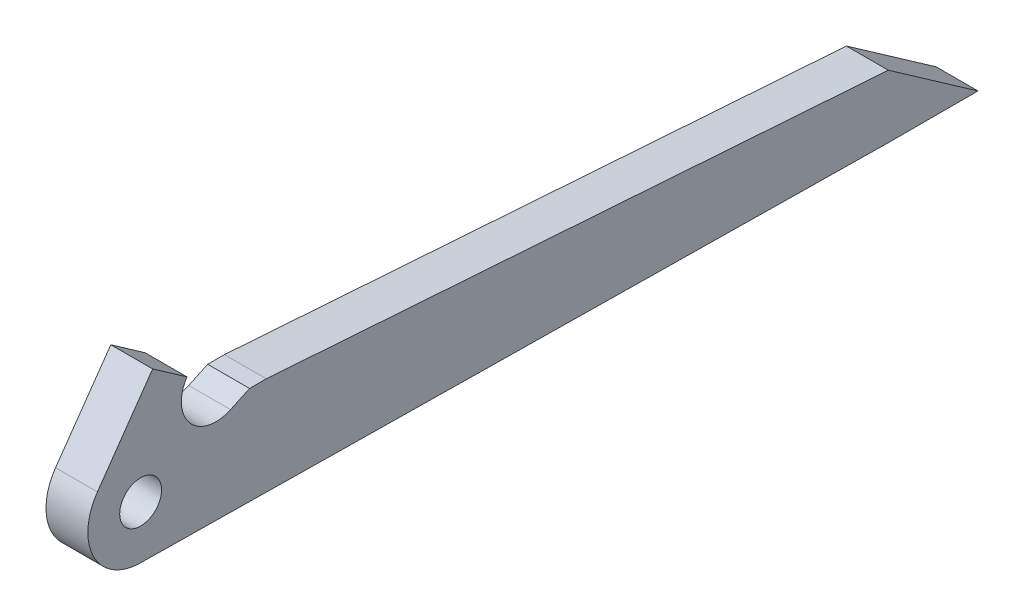
ISO-10303-21;
HEADER;
FILE_DESCRIPTION(('STEP AP214'),'2;1');
FILE_NAME('part.step','',(''),(''),'','','');
FILE_SCHEMA(('AUTOMOTIVE_DESIGN { 1 0 10303 214 1 1 1 1 }'));
ENDSEC;
DATA;
#1=APPLICATION_CONTEXT('core data for automotive mechanical design processes');
#2=APPLICATION_PROTOCOL_DEFINITION('international standard','automotive_design',2000,#1);
#3=PRODUCT_CONTEXT('',#1,'mechanical');
#4=PRODUCT('Part','Part','',(#3));
#5=PRODUCT_RELATED_PRODUCT_CATEGORY('part','',(#4));
#6=PRODUCT_DEFINITION_FORMATION('','',#4);
#7=PRODUCT_DEFINITION_CONTEXT('part definition',#1,'design');
#8=PRODUCT_DEFINITION('design','',#6,#7);
#9=PRODUCT_DEFINITION_SHAPE('','',#8);
#10=(LENGTH_UNIT() NAMED_UNIT(*) SI_UNIT(.MILLI.,.METRE.));
#11=(NAMED_UNIT(*) PLANE_ANGLE_UNIT() SI_UNIT($,.RADIAN.));
#12=(NAMED_UNIT(*) SI_UNIT($,.STERADIAN.) SOLID_ANGLE_UNIT());
#13=UNCERTAINTY_MEASURE_WITH_UNIT(LENGTH_MEASURE(1.E-05),#10,'distance_accuracy_value','');
#14=(GEOMETRIC_REPRESENTATION_CONTEXT(3) GLOBAL_UNCERTAINTY_ASSIGNED_CONTEXT((#13)) GLOBAL_UNIT_ASSIGNED_CONTEXT((#10,
#11,#12)) REPRESENTATION_CONTEXT('',''));
#15=CARTESIAN_POINT('',(0.,0.,0.));
#16=DIRECTION('',(0.,0.,1.));
#17=DIRECTION('',(1.,0.,0.));
#18=AXIS2_PLACEMENT_3D('',#15,#16,#17);
#19=CARTESIAN_POINT('',(4.7625,9.525,-176.47164647412));
#20=DIRECTION('',(1.,0.,0.));
#21=DIRECTION('',(0.,0.,-1.));
#22=AXIS2_PLACEMENT_3D('',#19,#20,#21);
#23=PLANE('',#22);
#24=CARTESIAN_POINT('',(4.7625,9.525,-176.47164647412));
#25=DIRECTION('',(1.,0.,0.));
#26=DIRECTION('',(0.,0.,-1.));
#27=AXIS2_PLACEMENT_3D('',#24,#25,#26);
#28=CIRCLE('',#27,8.00100000000001);
#29=CARTESIAN_POINT('',(4.7625,14.1141850672447,-169.917610967764));
#30=VERTEX_POINT('',#29);
#31=CARTESIAN_POINT('',(4.7625,1.52470715135464,-176.365272906379));
#32=VERTEX_POINT('',#31);
#33=EDGE_CURVE('E154',#30,#32,#28,.T.);
#34=ORIENTED_EDGE('',*,*,#33,.T.);
#35=DIRECTION('',(0.,-0.0132950340883751,-0.999911617128528));
#36=VECTOR('',#35,1.);
#37=CARTESIAN_POINT('',(4.7625,1.27000000001228,-195.521646474134));
#38=LINE('',#37,#36);
#39=CARTESIAN_POINT('',(4.7625,1.27000000001228,-195.521646474134));
#40=VERTEX_POINT('',#39);
#41=EDGE_CURVE('E156',#32,#40,#38,.T.);
#42=ORIENTED_EDGE('',*,*,#41,.T.);
#43=DIRECTION('',(0.,-0.0134597436336529,-0.999909413547706));
#44=VECTOR('',#43,1.);
#45=CARTESIAN_POINT('',(4.7625,1.27000000001228,-195.521646474134));
#46=LINE('',#45,#44);
#47=CARTESIAN_POINT('',(4.7625,1.22755538373154E-11,-289.868536709884));
#48=VERTEX_POINT('',#47);
#49=EDGE_CURVE('E218',#40,#48,#46,.T.);
#50=ORIENTED_EDGE('',*,*,#49,.T.);
#51=DIRECTION('',(0.,0.,-1.));
#52=VECTOR('',#51,1.);
#53=CARTESIAN_POINT('',(4.7625,1.22755538373154E-11,-289.868536709884));
#54=LINE('',#53,#52);
#55=CARTESIAN_POINT('',(4.7625,1.22755538373154E-11,-303.471646474121));
#56=VERTEX_POINT('',#55);
#57=EDGE_CURVE('E221',#48,#56,#54,.T.);
#58=ORIENTED_EDGE('',*,*,#57,.T.);
#59=DIRECTION('',(0.,0.573576436351047,0.819152044288991));
#60=VECTOR('',#59,1.);
#61=CARTESIAN_POINT('',(4.7625,9.52500000002455,-289.868536709884));
#62=LINE('',#61,#60);
#63=CARTESIAN_POINT('',(4.7625,9.52500000002455,-289.868536709884));
#64=VERTEX_POINT('',#63);
#65=EDGE_CURVE('E142',#56,#64,#62,.T.);
#66=ORIENTED_EDGE('',*,*,#65,.T.);
#67=DIRECTION('',(0.,0.0702051969833663,0.997532571055465));
#68=VECTOR('',#67,1.);
#69=CARTESIAN_POINT('',(4.7625,16.1650258056597,-195.52164647412));
#70=LINE('',#69,#68);
#71=CARTESIAN_POINT('',(4.7625,16.1650258056597,-195.52164647412));
#72=VERTEX_POINT('',#71);
#73=EDGE_CURVE('E148',#64,#72,#70,.T.);
#74=ORIENTED_EDGE('',*,*,#73,.T.);
#75=DIRECTION('',(0.,0.,1.));
#76=VECTOR('',#75,1.);
#77=CARTESIAN_POINT('',(4.7625,16.1650258056597,-192.993410989748));
#78=LINE('',#77,#76);
#79=CARTESIAN_POINT('',(4.7625,16.1650258056597,-192.993410989748));
#80=VERTEX_POINT('',#79);
#81=EDGE_CURVE('E158',#72,#80,#78,.T.);
#82=ORIENTED_EDGE('',*,*,#81,.T.);
#83=DIRECTION('',(0.,-0.422618261740697,0.906307787036651));
#84=VECTOR('',#83,1.);
#85=CARTESIAN_POINT('',(4.7625,14.823212824633,-190.115883765906));
#86=LINE('',#85,#84);
#87=CARTESIAN_POINT('',(4.7625,14.823212824633,-190.115883765906));
#88=VERTEX_POINT('',#87);
#89=EDGE_CURVE('E160',#80,#88,#86,.T.);
#90=ORIENTED_EDGE('',*,*,#89,.T.);
#91=CARTESIAN_POINT('',(4.7625,19.5790932010246,-187.898180325126));
#92=DIRECTION('',(-1.,0.,0.));
#93=DIRECTION('',(0.,0.,-1.));
#94=AXIS2_PLACEMENT_3D('',#91,#92,#93);
#95=CIRCLE('',#94,5.24753339253749);
#96=CARTESIAN_POINT('',(4.7625,22.4356903032563,-183.496310301906));
#97=VERTEX_POINT('',#96);
#98=EDGE_CURVE('E162',#88,#97,#95,.T.);
#99=ORIENTED_EDGE('',*,*,#98,.T.);
#100=DIRECTION('',(0.,0.573576436351047,0.819152044288991));
#101=VECTOR('',#100,1.);
#102=CARTESIAN_POINT('',(4.7625,26.0779006740854,-178.294694820671));
#103=LINE('',#102,#101);
#104=CARTESIAN_POINT('',(4.7625,26.0779006740854,-178.294694820671));
#105=VERTEX_POINT('',#104);
#106=EDGE_CURVE('E164',#97,#105,#103,.T.);
#107=ORIENTED_EDGE('',*,*,#106,.T.);
#108=DIRECTION('',(0.,-0.819152044288991,0.573576436351048));
#109=VECTOR('',#108,1.);
#110=CARTESIAN_POINT('',(4.7625,14.1141850672447,-169.917610967764));
#111=LINE('',#110,#109);
#112=EDGE_CURVE('E65',#105,#30,#111,.T.);
#113=ORIENTED_EDGE('',*,*,#112,.T.);
#114=EDGE_LOOP('',(#34,#42,#50,#58,#66,#74,#82,#90,#99,#107,#113));
#115=FACE_BOUND('',#114,.T.);
#116=CARTESIAN_POINT('',(4.7625,9.525,-176.47164647412));
#117=DIRECTION('',(1.,0.,0.));
#118=DIRECTION('',(0.,0.,-1.));
#119=AXIS2_PLACEMENT_3D('',#116,#117,#118);
#120=CIRCLE('',#119,3.17499999999995);
#121=CARTESIAN_POINT('',(4.7625,9.525,-173.296646474121));
#122=VERTEX_POINT('',#121);
#123=EDGE_CURVE('E146',#122,#122,#120,.T.);
#124=ORIENTED_EDGE('',*,*,#123,.F.);
#125=EDGE_LOOP('',(#124));
#126=FACE_BOUND('',#125,.T.);
#127=ADVANCED_FACE('F43',(#115,#126),#23,.T.);
#128=CARTESIAN_POINT('',(4.7625,9.525,-176.47164647412));
#129=DIRECTION('',(-1.,0.,0.));
#130=DIRECTION('',(0.,0.,1.));
#131=AXIS2_PLACEMENT_3D('',#128,#129,#130);
#132=CYLINDRICAL_SURFACE('',#131,8.00100000000001);
#133=DIRECTION('',(-1.,0.,0.));
#134=VECTOR('',#133,1.);
#135=CARTESIAN_POINT('',(4.7625,14.1141850672447,-169.917610967764));
#136=LINE('',#135,#134);
#137=CARTESIAN_POINT('',(-1.5875,14.1141850672447,-169.917610967764));
#138=VERTEX_POINT('',#137);
#139=EDGE_CURVE('E167',#30,#138,#136,.T.);
#140=ORIENTED_EDGE('',*,*,#139,.T.);
#141=CARTESIAN_POINT('',(-1.5875,9.525,-176.47164647412));
#142=DIRECTION('',(1.,0.,0.));
#143=DIRECTION('',(0.,0.,-1.));
#144=AXIS2_PLACEMENT_3D('',#141,#142,#143);
#145=CIRCLE('',#144,8.00100000000001);
#146=CARTESIAN_POINT('',(-1.5875,1.52470715135464,-176.365272906379));
#147=VERTEX_POINT('',#146);
#148=EDGE_CURVE('E197',#138,#147,#145,.T.);
#149=ORIENTED_EDGE('',*,*,#148,.T.);
#150=DIRECTION('',(-1.,0.,0.));
#151=VECTOR('',#150,1.);
#152=CARTESIAN_POINT('',(4.7625,1.52470715135464,-176.365272906379));
#153=LINE('',#152,#151);
#154=EDGE_CURVE('E51',#32,#147,#153,.T.);
#155=ORIENTED_EDGE('',*,*,#154,.F.);
#156=ORIENTED_EDGE('',*,*,#33,.F.);
#157=EDGE_LOOP('',(#140,#149,#155,#156));
#158=FACE_BOUND('',#157,.T.);
#159=ADVANCED_FACE('F45',(#158),#132,.T.);
#160=CARTESIAN_POINT('',(4.7625,1.27000000001228,-195.521646474134));
#161=DIRECTION('',(0.,0.999911617128528,-0.0132950340883751));
#162=DIRECTION('',(0.,0.0132950340883751,0.999911617128529));
#163=AXIS2_PLACEMENT_3D('',#160,#161,#162);
#164=PLANE('',#163);
#165=ORIENTED_EDGE('',*,*,#154,.T.);
#166=DIRECTION('',(0.,-0.0132950340883751,-0.999911617128529));
#167=VECTOR('',#166,1.);
#168=CARTESIAN_POINT('',(-1.5875,1.27000000001228,-195.521646474134));
#169=LINE('',#168,#167);
#170=CARTESIAN_POINT('',(-1.58750000000001,1.27000000001228,-195.521646474134));
#171=VERTEX_POINT('',#170);
#172=EDGE_CURVE('E193',#147,#171,#169,.T.);
#173=ORIENTED_EDGE('',*,*,#172,.T.);
#174=DIRECTION('',(-1.,0.,0.));
#175=VECTOR('',#174,1.);
#176=CARTESIAN_POINT('',(4.7625,1.27000000001228,-195.521646474134));
#177=LINE('',#176,#175);
#178=EDGE_CURVE('E185',#40,#171,#177,.T.);
#179=ORIENTED_EDGE('',*,*,#178,.F.);
#180=ORIENTED_EDGE('',*,*,#41,.F.);
#181=EDGE_LOOP('',(#165,#173,#179,#180));
#182=FACE_BOUND('',#181,.T.);
#183=ADVANCED_FACE('F191',(#182),#164,.F.);
#184=CARTESIAN_POINT('',(4.7625,16.1650258056597,-192.993410989748));
#185=DIRECTION('',(0.,-1.,0.));
#186=DIRECTION('',(0.,0.,-1.));
#187=AXIS2_PLACEMENT_3D('',#184,#185,#186);
#188=PLANE('',#187);
#189=DIRECTION('',(-1.,0.,0.));
#190=VECTOR('',#189,1.);
#191=CARTESIAN_POINT('',(4.7625,16.1650258056597,-195.52164647412));
#192=LINE('',#191,#190);
#193=CARTESIAN_POINT('',(-1.58750000000001,16.1650258056597,-195.52164647412));
#194=VERTEX_POINT('',#193);
#195=EDGE_CURVE('E182',#72,#194,#192,.T.);
#196=ORIENTED_EDGE('',*,*,#195,.T.);
#197=DIRECTION('',(0.,0.,1.));
#198=VECTOR('',#197,1.);
#199=CARTESIAN_POINT('',(-1.5875,16.1650258056597,-192.993410989748));
#200=LINE('',#199,#198);
#201=CARTESIAN_POINT('',(-1.5875,16.1650258056597,-192.993410989748));
#202=VERTEX_POINT('',#201);
#203=EDGE_CURVE('E203',#194,#202,#200,.T.);
#204=ORIENTED_EDGE('',*,*,#203,.T.);
#205=DIRECTION('',(-1.,0.,0.));
#206=VECTOR('',#205,1.);
#207=CARTESIAN_POINT('',(4.7625,16.1650258056597,-192.993410989748));
#208=LINE('',#207,#206);
#209=EDGE_CURVE('E179',#80,#202,#208,.T.);
#210=ORIENTED_EDGE('',*,*,#209,.F.);
#211=ORIENTED_EDGE('',*,*,#81,.F.);
#212=EDGE_LOOP('',(#196,#204,#210,#211));
#213=FACE_BOUND('',#212,.T.);
#214=ADVANCED_FACE('F232',(#213),#188,.F.);
#215=CARTESIAN_POINT('',(4.7625,14.823212824633,-190.115883765906));
#216=DIRECTION('',(0.,-0.906307787036651,-0.422618261740697));
#217=DIRECTION('',(0.,0.422618261740697,-0.906307787036651));
#218=AXIS2_PLACEMENT_3D('',#215,#216,#217);
#219=PLANE('',#218);
#220=ORIENTED_EDGE('',*,*,#209,.T.);
#221=DIRECTION('',(0.,-0.422618261740697,0.906307787036651));
#222=VECTOR('',#221,1.);
#223=CARTESIAN_POINT('',(-1.5875,14.823212824633,-190.115883765906));
#224=LINE('',#223,#222);
#225=CARTESIAN_POINT('',(-1.5875,14.823212824633,-190.115883765906));
#226=VERTEX_POINT('',#225);
#227=EDGE_CURVE('E212',#202,#226,#224,.T.);
#228=ORIENTED_EDGE('',*,*,#227,.T.);
#229=DIRECTION('',(-1.,0.,0.));
#230=VECTOR('',#229,1.);
#231=CARTESIAN_POINT('',(4.7625,14.823212824633,-190.115883765906));
#232=LINE('',#231,#230);
#233=EDGE_CURVE('E176',#88,#226,#232,.T.);
#234=ORIENTED_EDGE('',*,*,#233,.F.);
#235=ORIENTED_EDGE('',*,*,#89,.F.);
#236=EDGE_LOOP('',(#220,#228,#234,#235));
#237=FACE_BOUND('',#236,.T.);
#238=ADVANCED_FACE('F236',(#237),#219,.F.);
#239=CARTESIAN_POINT('',(4.7625,19.5790932010246,-187.898180325126));
#240=DIRECTION('',(-1.,0.,0.));
#241=DIRECTION('',(0.,0.,1.));
#242=AXIS2_PLACEMENT_3D('',#239,#240,#241);
#243=CYLINDRICAL_SURFACE('',#242,5.24753339253749);
#244=ORIENTED_EDGE('',*,*,#233,.T.);
#245=CARTESIAN_POINT('',(-1.5875,19.5790932010246,-187.898180325126));
#246=DIRECTION('',(1.,0.,0.));
#247=DIRECTION('',(0.,0.,-1.));
#248=AXIS2_PLACEMENT_3D('',#245,#246,#247);
#249=CIRCLE('',#248,5.24753339253749);
#250=CARTESIAN_POINT('',(-1.5875,22.4356903032563,-183.496310301906));
#251=VERTEX_POINT('',#250);
#252=EDGE_CURVE('E209',#226,#251,#249,.F.);
#253=ORIENTED_EDGE('',*,*,#252,.T.);
#254=DIRECTION('',(-1.,0.,0.));
#255=VECTOR('',#254,1.);
#256=CARTESIAN_POINT('',(4.7625,22.4356903032563,-183.496310301906));
#257=LINE('',#256,#255);
#258=EDGE_CURVE('E173',#97,#251,#257,.T.);
#259=ORIENTED_EDGE('',*,*,#258,.F.);
#260=ORIENTED_EDGE('',*,*,#98,.F.);
#261=EDGE_LOOP('',(#244,#253,#259,#260));
#262=FACE_BOUND('',#261,.T.);
#263=ADVANCED_FACE('F242',(#262),#243,.F.);
#264=CARTESIAN_POINT('',(4.7625,26.0779006740854,-178.294694820671));
#265=DIRECTION('',(0.,-0.819152044288991,0.573576436351047));
#266=DIRECTION('',(0.,-0.573576436351047,-0.819152044288991));
#267=AXIS2_PLACEMENT_3D('',#264,#265,#266);
#268=PLANE('',#267);
#269=ORIENTED_EDGE('',*,*,#258,.T.);
#270=DIRECTION('',(0.,0.573576436351047,0.819152044288991));
#271=VECTOR('',#270,1.);
#272=CARTESIAN_POINT('',(-1.5875,26.0779006740854,-178.294694820671));
#273=LINE('',#272,#271);
#274=CARTESIAN_POINT('',(-1.5875,26.0779006740854,-178.294694820671));
#275=VERTEX_POINT('',#274);
#276=EDGE_CURVE('E201',#251,#275,#273,.T.);
#277=ORIENTED_EDGE('',*,*,#276,.T.);
#278=DIRECTION('',(-1.,0.,0.));
#279=VECTOR('',#278,1.);
#280=CARTESIAN_POINT('',(4.7625,26.0779006740854,-178.294694820671));
#281=LINE('',#280,#279);
#282=EDGE_CURVE('E170',#105,#275,#281,.T.);
#283=ORIENTED_EDGE('',*,*,#282,.F.);
#284=ORIENTED_EDGE('',*,*,#106,.F.);
#285=EDGE_LOOP('',(#269,#277,#283,#284));
#286=FACE_BOUND('',#285,.T.);
#287=ADVANCED_FACE('F244',(#286),#268,.F.);
#288=CARTESIAN_POINT('',(4.7625,14.1141850672447,-169.917610967764));
#289=DIRECTION('',(0.,-0.573576436351048,-0.81915204428899));
#290=DIRECTION('',(0.,0.819152044288991,-0.573576436351048));
#291=AXIS2_PLACEMENT_3D('',#288,#289,#290);
#292=PLANE('',#291);
#293=ORIENTED_EDGE('',*,*,#282,.T.);
#294=DIRECTION('',(0.,-0.819152044288991,0.573576436351048));
#295=VECTOR('',#294,1.);
#296=CARTESIAN_POINT('',(-1.5875,14.1141850672447,-169.917610967764));
#297=LINE('',#296,#295);
#298=EDGE_CURVE('E199',#275,#138,#297,.T.);
#299=ORIENTED_EDGE('',*,*,#298,.T.);
#300=ORIENTED_EDGE('',*,*,#139,.F.);
#301=ORIENTED_EDGE('',*,*,#112,.F.);
#302=EDGE_LOOP('',(#293,#299,#300,#301));
#303=FACE_BOUND('',#302,.T.);
#304=ADVANCED_FACE('F246',(#303),#292,.F.);
#305=CARTESIAN_POINT('',(4.7625,9.525,-176.47164647412));
#306=DIRECTION('',(-1.,0.,0.));
#307=DIRECTION('',(0.,0.,1.));
#308=AXIS2_PLACEMENT_3D('',#305,#306,#307);
#309=CYLINDRICAL_SURFACE('',#308,3.17499999999995);
#310=CARTESIAN_POINT('',(-1.5875,9.525,-176.47164647412));
#311=DIRECTION('',(1.,0.,0.));
#312=DIRECTION('',(0.,0.,-1.));
#313=AXIS2_PLACEMENT_3D('',#310,#311,#312);
#314=CIRCLE('',#313,3.17499999999995);
#315=CARTESIAN_POINT('',(-1.5875,9.525,-173.296646474121));
#316=VERTEX_POINT('',#315);
#317=EDGE_CURVE('E215',#316,#316,#314,.T.);
#318=CARTESIAN_POINT('',(-1.5875,9.525,-173.296646474121));
#319=CARTESIAN_POINT('',(-1.52135416666667,9.525,-173.296646474121));
#320=CARTESIAN_POINT('',(-1.45520833333333,9.525,-173.296646474121));
#321=CARTESIAN_POINT('',(-1.32291666666667,9.525,-173.296646474121));
#322=CARTESIAN_POINT('',(-1.25677083333333,9.525,-173.296646474121));
#323=CARTESIAN_POINT('',(-1.12447916666667,9.525,-173.296646474121));
#324=CARTESIAN_POINT('',(-1.05833333333333,9.525,-173.296646474121));
#325=CARTESIAN_POINT('',(-0.926041666666667,9.525,-173.296646474121));
#326=CARTESIAN_POINT('',(-0.859895833333334,9.525,-173.296646474121));
#327=CARTESIAN_POINT('',(-0.727604166666667,9.525,-173.296646474121));
#328=CARTESIAN_POINT('',(-0.661458333333334,9.525,-173.296646474121));
#329=CARTESIAN_POINT('',(-0.529166666666667,9.525,-173.296646474121));
#330=CARTESIAN_POINT('',(-0.463020833333333,9.525,-173.296646474121));
#331=CARTESIAN_POINT('',(-0.330729166666666,9.525,-173.296646474121));
#332=CARTESIAN_POINT('',(-0.264583333333333,9.525,-173.296646474121));
#333=CARTESIAN_POINT('',(-0.132291666666667,9.525,-173.296646474121));
#334=CARTESIAN_POINT('',(-0.0661458333333333,9.525,-173.296646474121));
#335=CARTESIAN_POINT('',(0.0661458333333333,9.525,-173.296646474121));
#336=CARTESIAN_POINT('',(0.132291666666667,9.525,-173.296646474121));
#337=CARTESIAN_POINT('',(0.264583333333333,9.525,-173.296646474121));
#338=CARTESIAN_POINT('',(0.330729166666666,9.525,-173.296646474121));
#339=CARTESIAN_POINT('',(0.463020833333333,9.525,-173.296646474121));
#340=CARTESIAN_POINT('',(0.529166666666667,9.525,-173.296646474121));
#341=CARTESIAN_POINT('',(0.661458333333334,9.525,-173.296646474121));
#342=CARTESIAN_POINT('',(0.727604166666667,9.525,-173.296646474121));
#343=CARTESIAN_POINT('',(0.859895833333333,9.525,-173.296646474121));
#344=CARTESIAN_POINT('',(0.926041666666666,9.525,-173.296646474121));
#345=CARTESIAN_POINT('',(1.05833333333333,9.525,-173.296646474121));
#346=CARTESIAN_POINT('',(1.12447916666667,9.525,-173.296646474121));
#347=CARTESIAN_POINT('',(1.25677083333333,9.525,-173.296646474121));
#348=CARTESIAN_POINT('',(1.32291666666667,9.525,-173.296646474121));
#349=CARTESIAN_POINT('',(1.45520833333333,9.525,-173.296646474121));
#350=CARTESIAN_POINT('',(1.52135416666667,9.525,-173.296646474121));
#351=CARTESIAN_POINT('',(1.65364583333333,9.525,-173.296646474121));
#352=CARTESIAN_POINT('',(1.71979166666667,9.525,-173.296646474121));
#353=CARTESIAN_POINT('',(1.85208333333333,9.525,-173.296646474121));
#354=CARTESIAN_POINT('',(1.91822916666667,9.525,-173.296646474121));
#355=CARTESIAN_POINT('',(2.05052083333333,9.525,-173.296646474121));
#356=CARTESIAN_POINT('',(2.11666666666667,9.525,-173.296646474121));
#357=CARTESIAN_POINT('',(2.24895833333333,9.525,-173.296646474121));
#358=CARTESIAN_POINT('',(2.31510416666667,9.525,-173.296646474121));
#359=CARTESIAN_POINT('',(2.44739583333333,9.525,-173.296646474121));
#360=CARTESIAN_POINT('',(2.51354166666667,9.525,-173.296646474121));
#361=CARTESIAN_POINT('',(2.64583333333333,9.525,-173.296646474121));
#362=CARTESIAN_POINT('',(2.71197916666667,9.525,-173.296646474121));
#363=CARTESIAN_POINT('',(2.84427083333333,9.525,-173.296646474121));
#364=CARTESIAN_POINT('',(2.91041666666667,9.525,-173.296646474121));
#365=CARTESIAN_POINT('',(3.04270833333333,9.525,-173.296646474121));
#366=CARTESIAN_POINT('',(3.10885416666667,9.525,-173.296646474121));
#367=CARTESIAN_POINT('',(3.24114583333333,9.525,-173.296646474121));
#368=CARTESIAN_POINT('',(3.30729166666667,9.525,-173.296646474121));
#369=CARTESIAN_POINT('',(3.43958333333333,9.525,-173.296646474121));
#370=CARTESIAN_POINT('',(3.50572916666667,9.525,-173.296646474121));
#371=CARTESIAN_POINT('',(3.63802083333333,9.525,-173.296646474121));
#372=CARTESIAN_POINT('',(3.70416666666667,9.525,-173.296646474121));
#373=CARTESIAN_POINT('',(3.83645833333333,9.525,-173.296646474121));
#374=CARTESIAN_POINT('',(3.90260416666667,9.525,-173.296646474121));
#375=CARTESIAN_POINT('',(4.03489583333333,9.525,-173.296646474121));
#376=CARTESIAN_POINT('',(4.10104166666667,9.525,-173.296646474121));
#377=CARTESIAN_POINT('',(4.23333333333333,9.525,-173.296646474121));
#378=CARTESIAN_POINT('',(4.29947916666667,9.525,-173.296646474121));
#379=CARTESIAN_POINT('',(4.43177083333333,9.525,-173.296646474121));
#380=CARTESIAN_POINT('',(4.49791666666667,9.525,-173.296646474121));
#381=CARTESIAN_POINT('',(4.63020833333333,9.525,-173.296646474121));
#382=CARTESIAN_POINT('',(4.69635416666667,9.525,-173.296646474121));
#383=CARTESIAN_POINT('',(4.7625,9.525,-173.296646474121));
#384=B_SPLINE_CURVE_WITH_KNOTS('',3,(#318,#319,#320,#321,#322,#323,#324,#325,#326,#327,#328,
#329,#330,#331,#332,#333,#334,#335,#336,#337,#338,#339,#340,#341,#342,#343,#344,#345,#346,#347,
#348,#349,#350,#351,#352,#353,#354,#355,#356,#357,#358,#359,#360,#361,#362,#363,#364,#365,#366,
#367,#368,#369,#370,#371,#372,#373,#374,#375,#376,#377,#378,#379,#380,#381,#382,#383),
.UNSPECIFIED.,.F.,.F.,(4,2,2,2,2,2,2,2,2,2,2,2,2,2,2,2,2,2,2,2,2,2,2,2,2,2,2,2,2,2,2,2,4),(0.,
0.1984375,0.396875,0.5953125,0.79375,0.9921875,1.190625,1.3890625,1.5875,1.7859375,1.984375,
2.1828125,2.38125,2.5796875,2.778125,2.9765625,3.175,3.3734375,3.571875,3.7703125,3.96875,
4.1671875,4.365625,4.5640625,4.7625,4.9609375,5.159375,5.3578125,5.55625,5.7546875,5.953125,
6.1515625,6.35),.UNSPECIFIED.);
#385=EDGE_CURVE('BSEAM249',#316,#122,#384,.T.);
#386=ORIENTED_EDGE('',*,*,#317,.F.);
#387=ORIENTED_EDGE('',*,*,#123,.T.);
#388=ORIENTED_EDGE('',*,*,#385,.T.);
#389=ORIENTED_EDGE('',*,*,#385,.F.);
#390=EDGE_LOOP('',(#386,#388,#387,#389));
#391=FACE_BOUND('',#390,.T.);
#392=ADVANCED_FACE('F249',(#391),#309,.F.);
#393=CARTESIAN_POINT('',(-113.916109923343,16.1650258056597,-195.52164647412));
#394=DIRECTION('',(0.,0.997532571055465,-0.0702051969833663));
#395=DIRECTION('',(0.,0.0702051969833663,0.997532571055465));
#396=AXIS2_PLACEMENT_3D('',#393,#394,#395);
#397=PLANE('',#396);
#398=DIRECTION('',(0.,-0.0702051969833663,-0.997532571055465));
#399=VECTOR('',#398,1.);
#400=CARTESIAN_POINT('',(-1.58750000000001,16.1650258056597,-195.52164647412));
#401=LINE('',#400,#399);
#402=CARTESIAN_POINT('',(-1.58750000000001,9.52500000002453,-289.868536709884));
#403=VERTEX_POINT('',#402);
#404=EDGE_CURVE('E127',#194,#403,#401,.T.);
#405=ORIENTED_EDGE('',*,*,#404,.F.);
#406=ORIENTED_EDGE('',*,*,#195,.F.);
#407=ORIENTED_EDGE('',*,*,#73,.F.);
#408=DIRECTION('',(1.,0.,0.));
#409=VECTOR('',#408,1.);
#410=CARTESIAN_POINT('',(-113.916109923343,9.52500000002455,-289.868536709884));
#411=LINE('',#410,#409);
#412=EDGE_CURVE('E144',#403,#64,#411,.T.);
#413=ORIENTED_EDGE('',*,*,#412,.F.);
#414=EDGE_LOOP('',(#405,#406,#407,#413));
#415=FACE_BOUND('',#414,.T.);
#416=ADVANCED_FACE('F229',(#415),#397,.T.);
#417=CARTESIAN_POINT('',(-113.916109923343,9.52500000002455,-289.868536709884));
#418=DIRECTION('',(0.,0.819152044288991,-0.573576436351047));
#419=DIRECTION('',(0.,0.573576436351047,0.819152044288991));
#420=AXIS2_PLACEMENT_3D('',#417,#418,#419);
#421=PLANE('',#420);
#422=DIRECTION('',(0.,-0.573576436351047,-0.819152044288991));
#423=VECTOR('',#422,1.);
#424=CARTESIAN_POINT('',(-1.58750000000001,9.52500000002455,-289.868536709884));
#425=LINE('',#424,#423);
#426=CARTESIAN_POINT('',(-1.58750000000002,1.22749033160119E-11,-303.471646474121));
#427=VERTEX_POINT('',#426);
#428=EDGE_CURVE('E124',#403,#427,#425,.T.);
#429=ORIENTED_EDGE('',*,*,#428,.F.);
#430=ORIENTED_EDGE('',*,*,#412,.T.);
#431=ORIENTED_EDGE('',*,*,#65,.F.);
#432=DIRECTION('',(1.,0.,0.));
#433=VECTOR('',#432,1.);
#434=CARTESIAN_POINT('',(-113.916109923343,1.22755538373154E-11,-303.471646474121));
#435=LINE('',#434,#433);
#436=EDGE_CURVE('E136',#427,#56,#435,.T.);
#437=ORIENTED_EDGE('',*,*,#436,.F.);
#438=EDGE_LOOP('',(#429,#430,#431,#437));
#439=FACE_BOUND('',#438,.T.);
#440=ADVANCED_FACE('F140',(#439),#421,.T.);
#441=CARTESIAN_POINT('',(-113.916109923343,1.22755538373154E-11,-289.868536709884));
#442=DIRECTION('',(0.,-1.,0.));
#443=DIRECTION('',(0.,0.,-1.));
#444=AXIS2_PLACEMENT_3D('',#441,#442,#443);
#445=PLANE('',#444);
#446=DIRECTION('',(0.,0.,1.));
#447=VECTOR('',#446,1.);
#448=CARTESIAN_POINT('',(-1.58750000000001,1.22755538373154E-11,-289.868536709884));
#449=LINE('',#448,#447);
#450=CARTESIAN_POINT('',(-1.58750000000001,1.22755538373154E-11,-289.868536709884));
#451=VERTEX_POINT('',#450);
#452=EDGE_CURVE('E57',#427,#451,#449,.T.);
#453=ORIENTED_EDGE('',*,*,#452,.F.);
#454=ORIENTED_EDGE('',*,*,#436,.T.);
#455=ORIENTED_EDGE('',*,*,#57,.F.);
#456=DIRECTION('',(1.,0.,0.));
#457=VECTOR('',#456,1.);
#458=CARTESIAN_POINT('',(-113.916109923343,1.22755538373154E-11,-289.868536709884));
#459=LINE('',#458,#457);
#460=EDGE_CURVE('E138',#451,#48,#459,.T.);
#461=ORIENTED_EDGE('',*,*,#460,.F.);
#462=EDGE_LOOP('',(#453,#454,#455,#461));
#463=FACE_BOUND('',#462,.T.);
#464=ADVANCED_FACE('F134',(#463),#445,.T.);
#465=CARTESIAN_POINT('',(-113.916109923343,1.27000000001228,-195.521646474134));
#466=DIRECTION('',(0.,-0.999909413547705,0.0134597436336529));
#467=DIRECTION('',(0.,-0.0134597436336529,-0.999909413547706));
#468=AXIS2_PLACEMENT_3D('',#465,#466,#467);
#469=PLANE('',#468);
#470=DIRECTION('',(0.,0.0134597436336529,0.999909413547706));
#471=VECTOR('',#470,1.);
#472=CARTESIAN_POINT('',(-1.58750000000001,1.27000000001228,-195.521646474134));
#473=LINE('',#472,#471);
#474=EDGE_CURVE('E12',#451,#171,#473,.T.);
#475=ORIENTED_EDGE('',*,*,#474,.F.);
#476=ORIENTED_EDGE('',*,*,#460,.T.);
#477=ORIENTED_EDGE('',*,*,#49,.F.);
#478=ORIENTED_EDGE('',*,*,#178,.T.);
#479=EDGE_LOOP('',(#475,#476,#477,#478));
#480=FACE_BOUND('',#479,.T.);
#481=ADVANCED_FACE('F264',(#480),#469,.T.);
#482=CARTESIAN_POINT('',(-1.5875,9.525,-176.47164647412));
#483=DIRECTION('',(1.,0.,0.));
#484=DIRECTION('',(0.,0.,-1.));
#485=AXIS2_PLACEMENT_3D('',#482,#483,#484);
#486=PLANE('',#485);
#487=ORIENTED_EDGE('',*,*,#317,.T.);
#488=EDGE_LOOP('',(#487));
#489=FACE_BOUND('',#488,.T.);
#490=ORIENTED_EDGE('',*,*,#203,.F.);
#491=ORIENTED_EDGE('',*,*,#404,.T.);
#492=ORIENTED_EDGE('',*,*,#428,.T.);
#493=ORIENTED_EDGE('',*,*,#452,.T.);
#494=ORIENTED_EDGE('',*,*,#474,.T.);
#495=ORIENTED_EDGE('',*,*,#172,.F.);
#496=ORIENTED_EDGE('',*,*,#148,.F.);
#497=ORIENTED_EDGE('',*,*,#298,.F.);
#498=ORIENTED_EDGE('',*,*,#276,.F.);
#499=ORIENTED_EDGE('',*,*,#252,.F.);
#500=ORIENTED_EDGE('',*,*,#227,.F.);
#501=EDGE_LOOP('',(#490,#491,#492,#493,#494,#495,#496,#497,#498,#499,#500));
#502=FACE_BOUND('',#501,.T.);
#503=ADVANCED_FACE('F125',(#489,#502),#486,.F.);
#504=CLOSED_SHELL('',(#127,#159,#183,#214,#238,#263,#287,#304,#392,#416,#440,#464,#481,#503));
#505=MANIFOLD_SOLID_BREP('B2',#504);
#506=ADVANCED_BREP_SHAPE_REPRESENTATION('',(#18,#505),#14);
#507=SHAPE_DEFINITION_REPRESENTATION(#9,#506);
ENDSEC;
END-ISO-10303-21;
